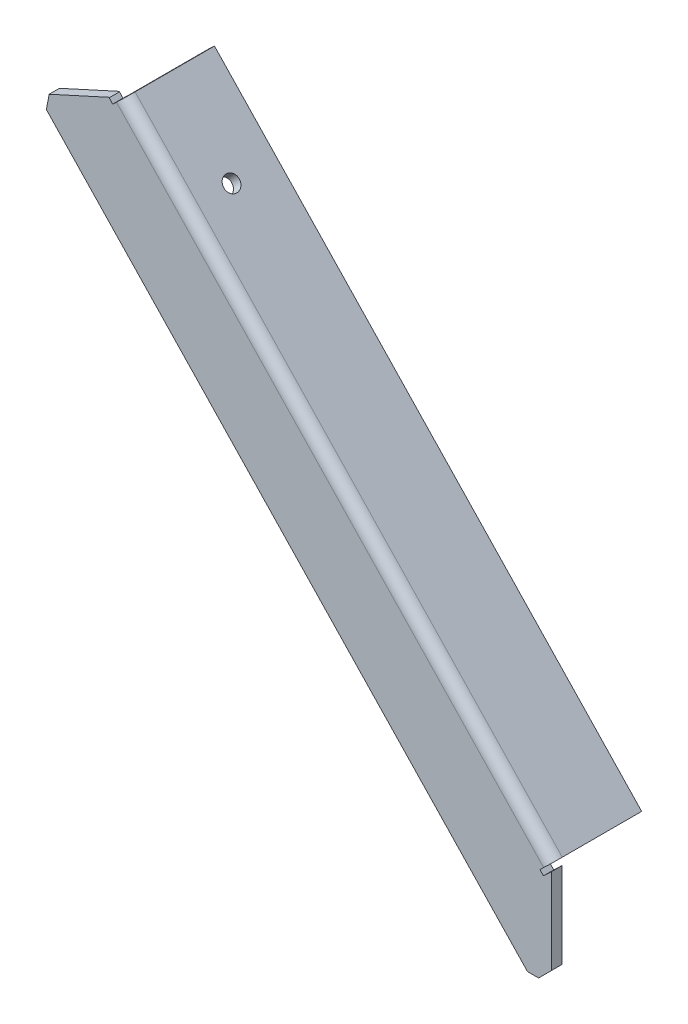
ISO-10303-21;
HEADER;
FILE_DESCRIPTION(('STEP AP214'),'2;1');
FILE_NAME('part.step','',(''),(''),'','','');
FILE_SCHEMA(('AUTOMOTIVE_DESIGN { 1 0 10303 214 1 1 1 1 }'));
ENDSEC;
DATA;
#1=APPLICATION_CONTEXT('core data for automotive mechanical design processes');
#2=APPLICATION_PROTOCOL_DEFINITION('international standard','automotive_design',2000,#1);
#3=PRODUCT_CONTEXT('',#1,'mechanical');
#4=PRODUCT('Part','Part','',(#3));
#5=PRODUCT_RELATED_PRODUCT_CATEGORY('part','',(#4));
#6=PRODUCT_DEFINITION_FORMATION('','',#4);
#7=PRODUCT_DEFINITION_CONTEXT('part definition',#1,'design');
#8=PRODUCT_DEFINITION('design','',#6,#7);
#9=PRODUCT_DEFINITION_SHAPE('','',#8);
#10=(LENGTH_UNIT() NAMED_UNIT(*) SI_UNIT(.MILLI.,.METRE.));
#11=(NAMED_UNIT(*) PLANE_ANGLE_UNIT() SI_UNIT($,.RADIAN.));
#12=(NAMED_UNIT(*) SI_UNIT($,.STERADIAN.) SOLID_ANGLE_UNIT());
#13=UNCERTAINTY_MEASURE_WITH_UNIT(LENGTH_MEASURE(1.E-05),#10,'distance_accuracy_value','');
#14=(GEOMETRIC_REPRESENTATION_CONTEXT(3) GLOBAL_UNCERTAINTY_ASSIGNED_CONTEXT((#13)) GLOBAL_UNIT_ASSIGNED_CONTEXT((#10,
#11,#12)) REPRESENTATION_CONTEXT('',''));
#15=CARTESIAN_POINT('',(0.,0.,0.));
#16=DIRECTION('',(0.,0.,1.));
#17=DIRECTION('',(1.,0.,0.));
#18=AXIS2_PLACEMENT_3D('',#15,#16,#17);
#19=CARTESIAN_POINT('',(-68.257223266206,120.395137547564,-4.));
#20=DIRECTION('',(-0.414693242656259,0.909961270876534,0.));
#21=DIRECTION('',(-0.909961270876534,-0.414693242656259,0.));
#22=AXIS2_PLACEMENT_3D('',#19,#20,#21);
#23=PLANE('',#22);
#24=DIRECTION('',(-0.909961270876534,-0.414693242656259,0.));
#25=VECTOR('',#24,1.);
#26=CARTESIAN_POINT('',(-68.257223266206,120.395137547564,0.));
#27=LINE('',#26,#25);
#28=CARTESIAN_POINT('',(-73.8308182261847,117.855103986597,0.));
#29=VERTEX_POINT('',#28);
#30=CARTESIAN_POINT('',(-97.4029724139567,107.112654423767,0.));
#31=VERTEX_POINT('',#30);
#32=EDGE_CURVE('E248',#29,#31,#27,.T.);
#33=ORIENTED_EDGE('',*,*,#32,.F.);
#34=DIRECTION('',(0.,0.,1.));
#35=VECTOR('',#34,1.);
#36=CARTESIAN_POINT('',(-73.8308182261848,117.855103986597,-3.99999999999999));
#37=LINE('',#36,#35);
#38=CARTESIAN_POINT('',(-73.8308182261847,117.855103986597,-4.));
#39=VERTEX_POINT('',#38);
#40=EDGE_CURVE('E264',#39,#29,#37,.T.);
#41=ORIENTED_EDGE('',*,*,#40,.F.);
#42=DIRECTION('',(-0.909961270876534,-0.414693242656259,0.));
#43=VECTOR('',#42,1.);
#44=CARTESIAN_POINT('',(-68.257223266206,120.395137547564,-4.));
#45=LINE('',#44,#43);
#46=CARTESIAN_POINT('',(-97.4029724139567,107.112654423767,-4.));
#47=VERTEX_POINT('',#46);
#48=EDGE_CURVE('E276',#39,#47,#45,.T.);
#49=ORIENTED_EDGE('',*,*,#48,.T.);
#50=DIRECTION('',(0.,0.,1.));
#51=VECTOR('',#50,1.);
#52=CARTESIAN_POINT('',(-97.4029724139567,107.112654423767,-4.));
#53=LINE('',#52,#51);
#54=EDGE_CURVE('E294',#47,#31,#53,.T.);
#55=ORIENTED_EDGE('',*,*,#54,.T.);
#56=EDGE_LOOP('',(#33,#41,#49,#55));
#57=FACE_BOUND('',#56,.T.);
#58=ADVANCED_FACE('F57',(#57),#23,.T.);
#59=CARTESIAN_POINT('',(97.5287824201261,-89.9528059930263,-4.));
#60=DIRECTION('',(1.,0.,0.));
#61=DIRECTION('',(0.,0.,-1.));
#62=AXIS2_PLACEMENT_3D('',#59,#60,#61);
#63=PLANE('',#62);
#64=DIRECTION('',(0.,1.,0.));
#65=VECTOR('',#64,1.);
#66=CARTESIAN_POINT('',(97.5287824201261,-89.9528059930263,-4.));
#67=LINE('',#66,#65);
#68=CARTESIAN_POINT('',(97.5287824201261,-89.9528059930263,-4.));
#69=VERTEX_POINT('',#68);
#70=CARTESIAN_POINT('',(97.5287824201261,-56.712657403248,-4.));
#71=VERTEX_POINT('',#70);
#72=EDGE_CURVE('E291',#69,#71,#67,.T.);
#73=ORIENTED_EDGE('',*,*,#72,.T.);
#74=DIRECTION('',(0.,0.,1.));
#75=VECTOR('',#74,1.);
#76=CARTESIAN_POINT('',(97.5287824201261,-56.712657403248,-3.99999999999999));
#77=LINE('',#76,#75);
#78=CARTESIAN_POINT('',(97.5287824201261,-56.712657403248,0.));
#79=VERTEX_POINT('',#78);
#80=EDGE_CURVE('E249',#71,#79,#77,.T.);
#81=ORIENTED_EDGE('',*,*,#80,.T.);
#82=DIRECTION('',(0.,1.,0.));
#83=VECTOR('',#82,1.);
#84=CARTESIAN_POINT('',(97.5287824201261,-89.9528059930263,0.));
#85=LINE('',#84,#83);
#86=CARTESIAN_POINT('',(97.5287824201261,-89.9528059930263,0.));
#87=VERTEX_POINT('',#86);
#88=EDGE_CURVE('E279',#87,#79,#85,.T.);
#89=ORIENTED_EDGE('',*,*,#88,.F.);
#90=DIRECTION('',(0.,0.,1.));
#91=VECTOR('',#90,1.);
#92=CARTESIAN_POINT('',(97.5287824201261,-89.9528059930263,-4.));
#93=LINE('',#92,#91);
#94=EDGE_CURVE('E310',#69,#87,#93,.T.);
#95=ORIENTED_EDGE('',*,*,#94,.F.);
#96=EDGE_LOOP('',(#73,#81,#89,#95));
#97=FACE_BOUND('',#96,.T.);
#98=ADVANCED_FACE('F344',(#97),#63,.T.);
#99=CARTESIAN_POINT('',(0.,0.,-4.));
#100=DIRECTION('',(0.,0.,-1.));
#101=DIRECTION('',(-1.,0.,0.));
#102=AXIS2_PLACEMENT_3D('',#99,#100,#101);
#103=PLANE('',#102);
#104=DIRECTION('',(-0.689089026915392,0.72467669548896,0.));
#105=VECTOR('',#104,1.);
#106=CARTESIAN_POINT('',(94.4139649619253,-59.6745113508797,-3.99999999999998));
#107=LINE('',#106,#105);
#108=CARTESIAN_POINT('',(94.4139649619253,-59.6745113508797,-4.));
#109=VERTEX_POINT('',#108);
#110=CARTESIAN_POINT('',(93.0357869080945,-58.2251579599017,-4.));
#111=VERTEX_POINT('',#110);
#112=EDGE_CURVE('E72',#109,#111,#107,.T.);
#113=ORIENTED_EDGE('',*,*,#112,.F.);
#114=DIRECTION('',(-0.72467669548896,-0.689089026915392,0.));
#115=VECTOR('',#114,1.);
#116=CARTESIAN_POINT('',(97.5287824201261,-56.712657403248,-3.99999999999999));
#117=LINE('',#116,#115);
#118=EDGE_CURVE('E245',#71,#109,#117,.T.);
#119=ORIENTED_EDGE('',*,*,#118,.F.);
#120=ORIENTED_EDGE('',*,*,#72,.F.);
#121=DIRECTION('',(0.707106781186548,0.707106781186548,0.));
#122=VECTOR('',#121,1.);
#123=CARTESIAN_POINT('',(92.5287824201262,-94.9528059930262,-4.));
#124=LINE('',#123,#122);
#125=CARTESIAN_POINT('',(92.5287824201262,-94.9528059930262,-4.));
#126=VERTEX_POINT('',#125);
#127=EDGE_CURVE('E288',#126,#69,#124,.T.);
#128=ORIENTED_EDGE('',*,*,#127,.F.);
#129=DIRECTION('',(1.,0.,0.));
#130=VECTOR('',#129,1.);
#131=CARTESIAN_POINT('',(88.2179408566115,-94.9528059930262,-4.));
#132=LINE('',#131,#130);
#133=CARTESIAN_POINT('',(88.2179408566115,-94.9528059930262,-4.));
#134=VERTEX_POINT('',#133);
#135=EDGE_CURVE('E285',#134,#126,#132,.T.);
#136=ORIENTED_EDGE('',*,*,#135,.F.);
#137=DIRECTION('',(0.689089026915392,-0.724676695488959,0.));
#138=VECTOR('',#137,1.);
#139=CARTESIAN_POINT('',(88.2179408566115,-94.9528059930262,-4.));
#140=LINE('',#139,#138);
#141=CARTESIAN_POINT('',(-98.5073336337625,101.415804733041,-4.));
#142=VERTEX_POINT('',#141);
#143=EDGE_CURVE('E282',#142,#134,#140,.T.);
#144=ORIENTED_EDGE('',*,*,#143,.F.);
#145=DIRECTION('',(-0.190311776555318,-0.981723702323805,0.));
#146=VECTOR('',#145,1.);
#147=CARTESIAN_POINT('',(-98.5073336337625,101.415804733041,-4.));
#148=LINE('',#147,#146);
#149=EDGE_CURVE('E278',#47,#142,#148,.T.);
#150=ORIENTED_EDGE('',*,*,#149,.F.);
#151=ORIENTED_EDGE('',*,*,#48,.F.);
#152=DIRECTION('',(0.724676695488965,0.689089026915386,0.));
#153=VECTOR('',#152,1.);
#154=CARTESIAN_POINT('',(-74.1283968320683,117.572138971666,-3.99999999999998));
#155=LINE('',#154,#153);
#156=CARTESIAN_POINT('',(-74.1283968320683,117.572138971666,-4.));
#157=VERTEX_POINT('',#156);
#158=EDGE_CURVE('E261',#157,#39,#155,.T.);
#159=ORIENTED_EDGE('',*,*,#158,.F.);
#160=DIRECTION('',(-0.689089026915392,0.72467669548896,0.));
#161=VECTOR('',#160,1.);
#162=CARTESIAN_POINT('',(-72.7502187782376,116.122785580688,-3.99999999999998));
#163=LINE('',#162,#161);
#164=CARTESIAN_POINT('',(-72.7502187782376,116.122785580688,-4.));
#165=VERTEX_POINT('',#164);
#166=EDGE_CURVE('E257',#165,#157,#163,.T.);
#167=ORIENTED_EDGE('',*,*,#166,.F.);
#168=DIRECTION('',(-0.72467669548896,-0.689089026915392,0.));
#169=VECTOR('',#168,1.);
#170=CARTESIAN_POINT('',(-71.3008653872596,117.500963634519,-3.99999999999998));
#171=LINE('',#170,#169);
#172=CARTESIAN_POINT('',(-71.3008653872596,117.500963634519,-4.));
#173=VERTEX_POINT('',#172);
#174=EDGE_CURVE('E254',#173,#165,#171,.T.);
#175=ORIENTED_EDGE('',*,*,#174,.F.);
#176=DIRECTION('',(0.689089026915392,-0.72467669548896,0.));
#177=VECTOR('',#176,1.);
#178=CARTESIAN_POINT('',(94.4851402990725,-56.846979906071,-3.99999999999998));
#179=LINE('',#178,#177);
#180=CARTESIAN_POINT('',(94.4851402990724,-56.846979906071,-4.));
#181=VERTEX_POINT('',#180);
#182=EDGE_CURVE('E236',#181,#173,#179,.F.);
#183=ORIENTED_EDGE('',*,*,#182,.F.);
#184=DIRECTION('',(0.72467669548896,0.689089026915392,0.));
#185=VECTOR('',#184,1.);
#186=CARTESIAN_POINT('',(93.0357869080945,-58.2251579599018,-3.99999999999998));
#187=LINE('',#186,#185);
#188=EDGE_CURVE('E77',#111,#181,#187,.T.);
#189=ORIENTED_EDGE('',*,*,#188,.F.);
#190=EDGE_LOOP('',(#113,#119,#120,#128,#136,#144,#150,#151,#159,#167,#175,#183,#189));
#191=FACE_BOUND('',#190,.T.);
#192=ADVANCED_FACE('F341',(#191),#103,.T.);
#193=CARTESIAN_POINT('',(0.,0.,0.));
#194=DIRECTION('',(0.,0.,-1.));
#195=DIRECTION('',(-1.,0.,0.));
#196=AXIS2_PLACEMENT_3D('',#193,#194,#195);
#197=PLANE('',#196);
#198=DIRECTION('',(0.72467669548896,0.689089026915392,0.));
#199=VECTOR('',#198,1.);
#200=CARTESIAN_POINT('',(74.6313425518323,-78.4856420402801,0.));
#201=LINE('',#200,#199);
#202=CARTESIAN_POINT('',(94.4139649619253,-59.6745113508797,0.));
#203=VERTEX_POINT('',#202);
#204=EDGE_CURVE('E13',#203,#79,#201,.T.);
#205=ORIENTED_EDGE('',*,*,#204,.F.);
#206=DIRECTION('',(0.689089026915392,-0.72467669548896,0.));
#207=VECTOR('',#206,1.);
#208=CARTESIAN_POINT('',(19.7826224100931,18.8111306894004,0.));
#209=LINE('',#208,#207);
#210=CARTESIAN_POINT('',(93.0357869080945,-58.2251579599017,0.));
#211=VERTEX_POINT('',#210);
#212=EDGE_CURVE('E65',#211,#203,#209,.T.);
#213=ORIENTED_EDGE('',*,*,#212,.F.);
#214=DIRECTION('',(-0.72467669548896,-0.689089026915392,0.));
#215=VECTOR('',#214,1.);
#216=CARTESIAN_POINT('',(73.2531644980014,-77.0362886493022,0.));
#217=LINE('',#216,#215);
#218=CARTESIAN_POINT('',(94.4851402990722,-56.8469799060712,0.));
#219=VERTEX_POINT('',#218);
#220=EDGE_CURVE('E329',#219,#211,#217,.T.);
#221=ORIENTED_EDGE('',*,*,#220,.F.);
#222=DIRECTION('',(0.689089026915392,-0.72467669548896,0.));
#223=VECTOR('',#222,1.);
#224=CARTESIAN_POINT('',(94.4851402990722,-56.8469799060713,0.));
#225=LINE('',#224,#223);
#226=CARTESIAN_POINT('',(-71.3008653872596,117.500963634519,0.));
#227=VERTEX_POINT('',#226);
#228=EDGE_CURVE('E182',#219,#227,#225,.F.);
#229=ORIENTED_EDGE('',*,*,#228,.T.);
#230=DIRECTION('',(0.72467669548896,0.689089026915392,0.));
#231=VECTOR('',#230,1.);
#232=CARTESIAN_POINT('',(-92.5328411883306,97.3116548912881,0.));
#233=LINE('',#232,#231);
#234=CARTESIAN_POINT('',(-72.7502187782376,116.122785580688,0.));
#235=VERTEX_POINT('',#234);
#236=EDGE_CURVE('E326',#235,#227,#233,.T.);
#237=ORIENTED_EDGE('',*,*,#236,.F.);
#238=DIRECTION('',(0.689089026915392,-0.72467669548896,0.));
#239=VECTOR('',#238,1.);
#240=CARTESIAN_POINT('',(19.782622410093,18.8111306894003,0.));
#241=LINE('',#240,#239);
#242=CARTESIAN_POINT('',(-74.1283968320683,117.572138971666,0.));
#243=VERTEX_POINT('',#242);
#244=EDGE_CURVE('E323',#243,#235,#241,.T.);
#245=ORIENTED_EDGE('',*,*,#244,.F.);
#246=DIRECTION('',(-0.724676695488965,-0.689089026915386,0.));
#247=VECTOR('',#246,1.);
#248=CARTESIAN_POINT('',(-93.9110192421607,98.7610082822669,0.));
#249=LINE('',#248,#247);
#250=EDGE_CURVE('E312',#29,#243,#249,.T.);
#251=ORIENTED_EDGE('',*,*,#250,.F.);
#252=ORIENTED_EDGE('',*,*,#32,.T.);
#253=DIRECTION('',(-0.190311776555318,-0.981723702323805,0.));
#254=VECTOR('',#253,1.);
#255=CARTESIAN_POINT('',(-98.5073336337625,101.415804733041,0.));
#256=LINE('',#255,#254);
#257=CARTESIAN_POINT('',(-98.5073336337625,101.415804733041,0.));
#258=VERTEX_POINT('',#257);
#259=EDGE_CURVE('E296',#31,#258,#256,.T.);
#260=ORIENTED_EDGE('',*,*,#259,.T.);
#261=DIRECTION('',(0.689089026915392,-0.724676695488959,0.));
#262=VECTOR('',#261,1.);
#263=CARTESIAN_POINT('',(88.2179408566115,-94.9528059930262,0.));
#264=LINE('',#263,#262);
#265=CARTESIAN_POINT('',(88.2179408566115,-94.9528059930262,0.));
#266=VERTEX_POINT('',#265);
#267=EDGE_CURVE('E299',#258,#266,#264,.T.);
#268=ORIENTED_EDGE('',*,*,#267,.T.);
#269=DIRECTION('',(1.,0.,0.));
#270=VECTOR('',#269,1.);
#271=CARTESIAN_POINT('',(88.2179408566115,-94.9528059930262,0.));
#272=LINE('',#271,#270);
#273=CARTESIAN_POINT('',(92.5287824201262,-94.9528059930262,0.));
#274=VERTEX_POINT('',#273);
#275=EDGE_CURVE('E302',#266,#274,#272,.T.);
#276=ORIENTED_EDGE('',*,*,#275,.T.);
#277=DIRECTION('',(0.707106781186548,0.707106781186548,0.));
#278=VECTOR('',#277,1.);
#279=CARTESIAN_POINT('',(92.5287824201262,-94.9528059930262,0.));
#280=LINE('',#279,#278);
#281=EDGE_CURVE('E305',#274,#87,#280,.T.);
#282=ORIENTED_EDGE('',*,*,#281,.T.);
#283=ORIENTED_EDGE('',*,*,#88,.T.);
#284=EDGE_LOOP('',(#205,#213,#221,#229,#237,#245,#251,#252,#260,#268,#276,#282,#283));
#285=FACE_BOUND('',#284,.T.);
#286=ADVANCED_FACE('F414',(#285),#197,.F.);
#287=CARTESIAN_POINT('',(92.5287824201262,-94.9528059930262,-4.));
#288=DIRECTION('',(0.707106781186547,-0.707106781186547,0.));
#289=DIRECTION('',(0.707106781186548,0.707106781186548,0.));
#290=AXIS2_PLACEMENT_3D('',#287,#288,#289);
#291=PLANE('',#290);
#292=ORIENTED_EDGE('',*,*,#281,.F.);
#293=DIRECTION('',(0.,0.,1.));
#294=VECTOR('',#293,1.);
#295=CARTESIAN_POINT('',(92.5287824201262,-94.9528059930262,-4.));
#296=LINE('',#295,#294);
#297=EDGE_CURVE('E313',#126,#274,#296,.T.);
#298=ORIENTED_EDGE('',*,*,#297,.F.);
#299=ORIENTED_EDGE('',*,*,#127,.T.);
#300=ORIENTED_EDGE('',*,*,#94,.T.);
#301=EDGE_LOOP('',(#292,#298,#299,#300));
#302=FACE_BOUND('',#301,.T.);
#303=ADVANCED_FACE('F348',(#302),#291,.T.);
#304=CARTESIAN_POINT('',(88.2179408566115,-94.9528059930262,-4.));
#305=DIRECTION('',(0.,-1.,0.));
#306=DIRECTION('',(0.,0.,-1.));
#307=AXIS2_PLACEMENT_3D('',#304,#305,#306);
#308=PLANE('',#307);
#309=ORIENTED_EDGE('',*,*,#275,.F.);
#310=DIRECTION('',(0.,0.,1.));
#311=VECTOR('',#310,1.);
#312=CARTESIAN_POINT('',(88.2179408566115,-94.9528059930262,-4.));
#313=LINE('',#312,#311);
#314=EDGE_CURVE('E315',#134,#266,#313,.T.);
#315=ORIENTED_EDGE('',*,*,#314,.F.);
#316=ORIENTED_EDGE('',*,*,#135,.T.);
#317=ORIENTED_EDGE('',*,*,#297,.T.);
#318=EDGE_LOOP('',(#309,#315,#316,#317));
#319=FACE_BOUND('',#318,.T.);
#320=ADVANCED_FACE('F353',(#319),#308,.T.);
#321=CARTESIAN_POINT('',(88.2179408566115,-94.9528059930262,-4.));
#322=DIRECTION('',(-0.724676695488959,-0.689089026915392,0.));
#323=DIRECTION('',(0.689089026915393,-0.724676695488959,0.));
#324=AXIS2_PLACEMENT_3D('',#321,#322,#323);
#325=PLANE('',#324);
#326=ORIENTED_EDGE('',*,*,#267,.F.);
#327=DIRECTION('',(0.,0.,1.));
#328=VECTOR('',#327,1.);
#329=CARTESIAN_POINT('',(-98.5073336337625,101.415804733041,-4.));
#330=LINE('',#329,#328);
#331=EDGE_CURVE('E317',#142,#258,#330,.T.);
#332=ORIENTED_EDGE('',*,*,#331,.F.);
#333=ORIENTED_EDGE('',*,*,#143,.T.);
#334=ORIENTED_EDGE('',*,*,#314,.T.);
#335=EDGE_LOOP('',(#326,#332,#333,#334));
#336=FACE_BOUND('',#335,.T.);
#337=ADVANCED_FACE('F356',(#336),#325,.T.);
#338=CARTESIAN_POINT('',(-98.5073336337625,101.415804733041,-4.));
#339=DIRECTION('',(-0.981723702323805,0.190311776555318,0.));
#340=DIRECTION('',(-0.190311776555318,-0.981723702323805,0.));
#341=AXIS2_PLACEMENT_3D('',#338,#339,#340);
#342=PLANE('',#341);
#343=ORIENTED_EDGE('',*,*,#259,.F.);
#344=ORIENTED_EDGE('',*,*,#54,.F.);
#345=ORIENTED_EDGE('',*,*,#149,.T.);
#346=ORIENTED_EDGE('',*,*,#331,.T.);
#347=EDGE_LOOP('',(#343,#344,#345,#346));
#348=FACE_BOUND('',#347,.T.);
#349=ADVANCED_FACE('F362',(#348),#342,.T.);
#350=CARTESIAN_POINT('',(97.5287824201261,-56.712657403248,-3.99999999999999));
#351=DIRECTION('',(-0.689089026915392,0.72467669548896,0.));
#352=DIRECTION('',(-0.72467669548896,-0.689089026915392,0.));
#353=AXIS2_PLACEMENT_3D('',#350,#351,#352);
#354=PLANE('',#353);
#355=DIRECTION('',(0.,0.,1.));
#356=VECTOR('',#355,1.);
#357=CARTESIAN_POINT('',(94.4139649619253,-59.6745113508797,-3.99999999999998));
#358=LINE('',#357,#356);
#359=EDGE_CURVE('E251',#109,#203,#358,.T.);
#360=ORIENTED_EDGE('',*,*,#359,.T.);
#361=ORIENTED_EDGE('',*,*,#204,.T.);
#362=ORIENTED_EDGE('',*,*,#80,.F.);
#363=ORIENTED_EDGE('',*,*,#118,.T.);
#364=EDGE_LOOP('',(#360,#361,#362,#363));
#365=FACE_BOUND('',#364,.T.);
#366=ADVANCED_FACE('F338',(#365),#354,.T.);
#367=CARTESIAN_POINT('',(94.4139649619253,-59.6745113508797,-3.99999999999998));
#368=DIRECTION('',(0.72467669548896,0.689089026915392,0.));
#369=DIRECTION('',(-0.689089026915392,0.72467669548896,0.));
#370=AXIS2_PLACEMENT_3D('',#367,#368,#369);
#371=PLANE('',#370);
#372=DIRECTION('',(0.,0.,1.));
#373=VECTOR('',#372,1.);
#374=CARTESIAN_POINT('',(93.0357869080945,-58.2251579599018,-3.99999999999998));
#375=LINE('',#374,#373);
#376=EDGE_CURVE('E253',#111,#211,#375,.T.);
#377=ORIENTED_EDGE('',*,*,#376,.T.);
#378=ORIENTED_EDGE('',*,*,#212,.T.);
#379=ORIENTED_EDGE('',*,*,#359,.F.);
#380=ORIENTED_EDGE('',*,*,#112,.T.);
#381=EDGE_LOOP('',(#377,#378,#379,#380));
#382=FACE_BOUND('',#381,.T.);
#383=ADVANCED_FACE('F334',(#382),#371,.T.);
#384=CARTESIAN_POINT('',(93.0357869080945,-58.2251579599018,-3.99999999999998));
#385=DIRECTION('',(0.689089026915392,-0.72467669548896,0.));
#386=DIRECTION('',(0.72467669548896,0.689089026915392,0.));
#387=AXIS2_PLACEMENT_3D('',#384,#385,#386);
#388=PLANE('',#387);
#389=DIRECTION('',(0.,0.,1.));
#390=VECTOR('',#389,1.);
#391=CARTESIAN_POINT('',(94.4851402990724,-56.846979906071,-3.99999999999998));
#392=LINE('',#391,#390);
#393=EDGE_CURVE('E232',#181,#219,#392,.T.);
#394=ORIENTED_EDGE('',*,*,#393,.T.);
#395=ORIENTED_EDGE('',*,*,#220,.T.);
#396=ORIENTED_EDGE('',*,*,#376,.F.);
#397=ORIENTED_EDGE('',*,*,#188,.T.);
#398=EDGE_LOOP('',(#394,#395,#396,#397));
#399=FACE_BOUND('',#398,.T.);
#400=ADVANCED_FACE('F431',(#399),#388,.T.);
#401=CARTESIAN_POINT('',(-71.3008653872596,117.500963634519,-3.99999999999998));
#402=DIRECTION('',(-0.689089026915392,0.72467669548896,0.));
#403=DIRECTION('',(-0.72467669548896,-0.689089026915392,0.));
#404=AXIS2_PLACEMENT_3D('',#401,#402,#403);
#405=PLANE('',#404);
#406=DIRECTION('',(0.,0.,1.));
#407=VECTOR('',#406,1.);
#408=CARTESIAN_POINT('',(-72.7502187782376,116.122785580688,-3.99999999999998));
#409=LINE('',#408,#407);
#410=EDGE_CURVE('E260',#165,#235,#409,.T.);
#411=ORIENTED_EDGE('',*,*,#410,.T.);
#412=ORIENTED_EDGE('',*,*,#236,.T.);
#413=DIRECTION('',(0.,-1.38777878078132E-13,1.));
#414=VECTOR('',#413,1.);
#415=CARTESIAN_POINT('',(-71.3008653872596,117.500963634519,-3.99999999999998));
#416=LINE('',#415,#414);
#417=EDGE_CURVE('E240',#173,#227,#416,.T.);
#418=ORIENTED_EDGE('',*,*,#417,.F.);
#419=ORIENTED_EDGE('',*,*,#174,.T.);
#420=EDGE_LOOP('',(#411,#412,#418,#419));
#421=FACE_BOUND('',#420,.T.);
#422=ADVANCED_FACE('F373',(#421),#405,.T.);
#423=CARTESIAN_POINT('',(-72.7502187782376,116.122785580688,-3.99999999999998));
#424=DIRECTION('',(0.72467669548896,0.689089026915392,0.));
#425=DIRECTION('',(-0.689089026915392,0.72467669548896,0.));
#426=AXIS2_PLACEMENT_3D('',#423,#424,#425);
#427=PLANE('',#426);
#428=DIRECTION('',(0.,0.,1.));
#429=VECTOR('',#428,1.);
#430=CARTESIAN_POINT('',(-74.1283968320683,117.572138971666,-3.99999999999998));
#431=LINE('',#430,#429);
#432=EDGE_CURVE('E243',#157,#243,#431,.T.);
#433=ORIENTED_EDGE('',*,*,#432,.T.);
#434=ORIENTED_EDGE('',*,*,#244,.T.);
#435=ORIENTED_EDGE('',*,*,#410,.F.);
#436=ORIENTED_EDGE('',*,*,#166,.T.);
#437=EDGE_LOOP('',(#433,#434,#435,#436));
#438=FACE_BOUND('',#437,.T.);
#439=ADVANCED_FACE('F370',(#438),#427,.T.);
#440=CARTESIAN_POINT('',(-74.1283968320683,117.572138971666,-3.99999999999998));
#441=DIRECTION('',(0.689089026915386,-0.724676695488965,0.));
#442=DIRECTION('',(0.724676695488965,0.689089026915386,0.));
#443=AXIS2_PLACEMENT_3D('',#440,#441,#442);
#444=PLANE('',#443);
#445=ORIENTED_EDGE('',*,*,#40,.T.);
#446=ORIENTED_EDGE('',*,*,#250,.T.);
#447=ORIENTED_EDGE('',*,*,#432,.F.);
#448=ORIENTED_EDGE('',*,*,#158,.T.);
#449=EDGE_LOOP('',(#445,#446,#447,#448));
#450=FACE_BOUND('',#449,.T.);
#451=ADVANCED_FACE('F367',(#450),#444,.T.);
#452=CARTESIAN_POINT('',(-71.3008653872596,117.500963634519,-4.2));
#453=DIRECTION('',(-0.689089026915392,0.72467669548896,0.));
#454=DIRECTION('',(-0.72467669548896,-0.689089026915392,0.));
#455=AXIS2_PLACEMENT_3D('',#452,#453,#454);
#456=PLANE('',#455);
#457=DIRECTION('',(0.72467669548896,0.689089026915392,0.));
#458=VECTOR('',#457,1.);
#459=CARTESIAN_POINT('',(-68.257223266206,120.395137547564,-4.19999999999999));
#460=LINE('',#459,#458);
#461=CARTESIAN_POINT('',(-71.1559300481618,117.638781439902,-4.2));
#462=VERTEX_POINT('',#461);
#463=CARTESIAN_POINT('',(-68.257223266206,120.395137547564,-4.19999999999999));
#464=VERTEX_POINT('',#463);
#465=EDGE_CURVE('E227',#462,#464,#460,.T.);
#466=ORIENTED_EDGE('',*,*,#465,.F.);
#467=CARTESIAN_POINT('',(-71.3008653872596,117.500963634519,-4.2));
#468=DIRECTION('',(0.689089026915392,-0.72467669548896,0.));
#469=DIRECTION('',(0.72467669548896,0.689089026915392,0.));
#470=AXIS2_PLACEMENT_3D('',#467,#468,#469);
#471=CIRCLE('',#470,0.200000000000019);
#472=EDGE_CURVE('E185',#173,#462,#471,.F.);
#473=ORIENTED_EDGE('',*,*,#472,.F.);
#474=ORIENTED_EDGE('',*,*,#417,.T.);
#475=CARTESIAN_POINT('',(-71.3008653872596,117.500963634519,-4.2));
#476=DIRECTION('',(0.689089026915392,-0.72467669548896,0.));
#477=DIRECTION('',(0.72467669548896,0.689089026915392,0.));
#478=AXIS2_PLACEMENT_3D('',#475,#476,#477);
#479=CIRCLE('',#478,4.20000000000002);
#480=EDGE_CURVE('E231',#227,#464,#479,.F.);
#481=ORIENTED_EDGE('',*,*,#480,.T.);
#482=EDGE_LOOP('',(#466,#473,#474,#481));
#483=FACE_BOUND('',#482,.T.);
#484=ADVANCED_FACE('F379',(#483),#456,.T.);
#485=CARTESIAN_POINT('',(94.4851402990725,-56.846979906071,-4.2));
#486=DIRECTION('',(-0.689089026915392,0.72467669548896,0.));
#487=DIRECTION('',(-0.72467669548896,-0.689089026915392,0.));
#488=AXIS2_PLACEMENT_3D('',#485,#486,#487);
#489=PLANE('',#488);
#490=CARTESIAN_POINT('',(94.4851402990725,-56.846979906071,-4.2));
#491=DIRECTION('',(0.689089026915392,-0.72467669548896,0.));
#492=DIRECTION('',(0.72467669548896,0.689089026915392,0.));
#493=AXIS2_PLACEMENT_3D('',#490,#491,#492);
#494=CIRCLE('',#493,0.200000000000019);
#495=CARTESIAN_POINT('',(94.6300756381703,-56.7091621006879,-4.2));
#496=VERTEX_POINT('',#495);
#497=EDGE_CURVE('E192',#496,#181,#494,.T.);
#498=ORIENTED_EDGE('',*,*,#497,.F.);
#499=DIRECTION('',(0.72467669548896,0.689089026915392,0.));
#500=VECTOR('',#499,1.);
#501=CARTESIAN_POINT('',(94.6300756381702,-56.7091621006879,-4.2));
#502=LINE('',#501,#500);
#503=CARTESIAN_POINT('',(97.5287824201261,-53.9528059930263,-4.19999999999999));
#504=VERTEX_POINT('',#503);
#505=EDGE_CURVE('E189',#496,#504,#502,.T.);
#506=ORIENTED_EDGE('',*,*,#505,.T.);
#507=CARTESIAN_POINT('',(94.4851402990725,-56.846979906071,-4.2));
#508=DIRECTION('',(0.689089026915392,-0.72467669548896,0.));
#509=DIRECTION('',(0.72467669548896,0.689089026915392,0.));
#510=AXIS2_PLACEMENT_3D('',#507,#508,#509);
#511=CIRCLE('',#510,4.20000000000002);
#512=EDGE_CURVE('E175',#504,#219,#511,.T.);
#513=ORIENTED_EDGE('',*,*,#512,.T.);
#514=ORIENTED_EDGE('',*,*,#393,.F.);
#515=EDGE_LOOP('',(#498,#506,#513,#514));
#516=FACE_BOUND('',#515,.T.);
#517=ADVANCED_FACE('F190',(#516),#489,.F.);
#518=CARTESIAN_POINT('',(94.4851402990725,-56.846979906071,-4.2));
#519=DIRECTION('',(0.689089026915392,-0.72467669548896,0.));
#520=DIRECTION('',(0.72467669548896,0.689089026915392,0.));
#521=AXIS2_PLACEMENT_3D('',#518,#519,#520);
#522=CYLINDRICAL_SURFACE('',#521,4.20000000000002);
#523=ORIENTED_EDGE('',*,*,#228,.F.);
#524=ORIENTED_EDGE('',*,*,#512,.F.);
#525=DIRECTION('',(0.689089026915392,-0.72467669548896,0.));
#526=VECTOR('',#525,1.);
#527=CARTESIAN_POINT('',(24.2756179221246,23.0834826562758,-4.19999999999999));
#528=LINE('',#527,#526);
#529=EDGE_CURVE('E180',#464,#504,#528,.T.);
#530=ORIENTED_EDGE('',*,*,#529,.F.);
#531=ORIENTED_EDGE('',*,*,#480,.F.);
#532=EDGE_LOOP('',(#523,#524,#530,#531));
#533=FACE_BOUND('',#532,.T.);
#534=ADVANCED_FACE('F177',(#533),#522,.T.);
#535=CARTESIAN_POINT('',(94.4851402990725,-56.846979906071,-4.2));
#536=DIRECTION('',(0.689089026915392,-0.72467669548896,0.));
#537=DIRECTION('',(0.72467669548896,0.689089026915392,0.));
#538=AXIS2_PLACEMENT_3D('',#535,#536,#537);
#539=CYLINDRICAL_SURFACE('',#538,0.200000000000019);
#540=ORIENTED_EDGE('',*,*,#182,.T.);
#541=ORIENTED_EDGE('',*,*,#472,.T.);
#542=DIRECTION('',(-0.689089026915392,0.72467669548896,0.));
#543=VECTOR('',#542,1.);
#544=CARTESIAN_POINT('',(-71.1559300481618,117.638781439902,-4.2));
#545=LINE('',#544,#543);
#546=EDGE_CURVE('E197',#462,#496,#545,.F.);
#547=ORIENTED_EDGE('',*,*,#546,.T.);
#548=ORIENTED_EDGE('',*,*,#497,.T.);
#549=EDGE_LOOP('',(#540,#541,#547,#548));
#550=FACE_BOUND('',#549,.T.);
#551=ADVANCED_FACE('F377',(#550),#539,.F.);
#552=CARTESIAN_POINT('',(97.5287824201261,-53.9528059930263,-3.99999999999999));
#553=DIRECTION('',(0.689089026915392,-0.72467669548896,0.));
#554=DIRECTION('',(0.72467669548896,0.689089026915392,0.));
#555=AXIS2_PLACEMENT_3D('',#552,#553,#554);
#556=PLANE('',#555);
#557=DIRECTION('',(0.,0.,1.));
#558=VECTOR('',#557,1.);
#559=CARTESIAN_POINT('',(97.5287824201261,-53.9528059930263,-3.99999999999999));
#560=LINE('',#559,#558);
#561=CARTESIAN_POINT('',(97.5287824201262,-53.9528059930263,-35.));
#562=VERTEX_POINT('',#561);
#563=EDGE_CURVE('E204',#562,#504,#560,.T.);
#564=ORIENTED_EDGE('',*,*,#563,.T.);
#565=ORIENTED_EDGE('',*,*,#505,.F.);
#566=DIRECTION('',(0.,0.,-1.));
#567=VECTOR('',#566,1.);
#568=CARTESIAN_POINT('',(94.6300756381702,-56.7091621006879,1.41199178046745E-13));
#569=LINE('',#568,#567);
#570=CARTESIAN_POINT('',(94.6300756381703,-56.7091621006878,-35.));
#571=VERTEX_POINT('',#570);
#572=EDGE_CURVE('E220',#571,#496,#569,.F.);
#573=ORIENTED_EDGE('',*,*,#572,.F.);
#574=DIRECTION('',(-0.72467669548896,-0.689089026915392,0.));
#575=VECTOR('',#574,1.);
#576=CARTESIAN_POINT('',(97.5287824201262,-53.9528059930263,-35.));
#577=LINE('',#576,#575);
#578=EDGE_CURVE('E209',#562,#571,#577,.T.);
#579=ORIENTED_EDGE('',*,*,#578,.F.);
#580=EDGE_LOOP('',(#564,#565,#573,#579));
#581=FACE_BOUND('',#580,.T.);
#582=ADVANCED_FACE('F208',(#581),#556,.T.);
#583=CARTESIAN_POINT('',(-68.2572232662059,120.395137547564,-35.));
#584=DIRECTION('',(-0.689089026915392,0.72467669548896,0.));
#585=DIRECTION('',(-0.72467669548896,-0.689089026915392,0.));
#586=AXIS2_PLACEMENT_3D('',#583,#584,#585);
#587=PLANE('',#586);
#588=DIRECTION('',(0.,0.,1.));
#589=VECTOR('',#588,1.);
#590=CARTESIAN_POINT('',(-71.1559300481618,117.638781439902,0.));
#591=LINE('',#590,#589);
#592=CARTESIAN_POINT('',(-71.1559300481617,117.638781439902,-35.));
#593=VERTEX_POINT('',#592);
#594=EDGE_CURVE('E206',#462,#593,#591,.F.);
#595=ORIENTED_EDGE('',*,*,#594,.F.);
#596=ORIENTED_EDGE('',*,*,#465,.T.);
#597=DIRECTION('',(0.,0.,-1.));
#598=VECTOR('',#597,1.);
#599=CARTESIAN_POINT('',(-68.2572232662059,120.395137547564,-35.));
#600=LINE('',#599,#598);
#601=CARTESIAN_POINT('',(-68.2572232662059,120.395137547564,-35.));
#602=VERTEX_POINT('',#601);
#603=EDGE_CURVE('E205',#464,#602,#600,.T.);
#604=ORIENTED_EDGE('',*,*,#603,.T.);
#605=DIRECTION('',(-0.72467669548896,-0.689089026915392,0.));
#606=VECTOR('',#605,1.);
#607=CARTESIAN_POINT('',(-68.2572232662059,120.395137547564,-35.));
#608=LINE('',#607,#606);
#609=EDGE_CURVE('E211',#602,#593,#608,.T.);
#610=ORIENTED_EDGE('',*,*,#609,.T.);
#611=EDGE_LOOP('',(#595,#596,#604,#610));
#612=FACE_BOUND('',#611,.T.);
#613=ADVANCED_FACE('F382',(#612),#587,.T.);
#614=CARTESIAN_POINT('',(24.2756179221246,23.0834826562758,1.30839783981396E-13));
#615=DIRECTION('',(0.72467669548896,0.689089026915392,0.));
#616=DIRECTION('',(-0.689089026915392,0.72467669548896,0.));
#617=AXIS2_PLACEMENT_3D('',#614,#615,#616);
#618=PLANE('',#617);
#619=CARTESIAN_POINT('',(-44.1391073241673,95.0314532054502,-17.5));
#620=DIRECTION('',(0.72467669548896,0.689089026915392,0.));
#621=DIRECTION('',(-0.689089026915392,0.72467669548896,0.));
#622=AXIS2_PLACEMENT_3D('',#619,#620,#621);
#623=CIRCLE('',#622,3.00000000000001);
#624=CARTESIAN_POINT('',(-46.2063744049135,97.2054832919171,-17.5));
#625=VERTEX_POINT('',#624);
#626=EDGE_CURVE('E390',#625,#625,#623,.T.);
#627=ORIENTED_EDGE('',*,*,#626,.F.);
#628=EDGE_LOOP('',(#627));
#629=FACE_BOUND('',#628,.T.);
#630=ORIENTED_EDGE('',*,*,#603,.F.);
#631=ORIENTED_EDGE('',*,*,#529,.T.);
#632=ORIENTED_EDGE('',*,*,#563,.F.);
#633=DIRECTION('',(0.689089026915392,-0.72467669548896,0.));
#634=VECTOR('',#633,1.);
#635=CARTESIAN_POINT('',(97.5287824201262,-53.9528059930263,-35.));
#636=LINE('',#635,#634);
#637=EDGE_CURVE('E212',#602,#562,#636,.T.);
#638=ORIENTED_EDGE('',*,*,#637,.F.);
#639=EDGE_LOOP('',(#630,#631,#632,#638));
#640=FACE_BOUND('',#639,.T.);
#641=ADVANCED_FACE('F202',(#629,#640),#618,.T.);
#642=CARTESIAN_POINT('',(21.3769111401687,20.3271265486143,1.16873858626024E-13));
#643=DIRECTION('',(0.72467669548896,0.689089026915392,0.));
#644=DIRECTION('',(-0.689089026915392,0.72467669548896,0.));
#645=AXIS2_PLACEMENT_3D('',#642,#643,#644);
#646=PLANE('',#645);
#647=CARTESIAN_POINT('',(-47.0378141061231,92.2750970977887,-17.5));
#648=DIRECTION('',(0.72467669548896,0.689089026915392,0.));
#649=DIRECTION('',(-0.689089026915392,0.72467669548896,0.));
#650=AXIS2_PLACEMENT_3D('',#647,#648,#649);
#651=CIRCLE('',#650,3.00000000000001);
#652=CARTESIAN_POINT('',(-49.1050811868693,94.4491271842556,-17.5));
#653=VERTEX_POINT('',#652);
#654=EDGE_CURVE('E60',#653,#653,#651,.T.);
#655=ORIENTED_EDGE('',*,*,#654,.T.);
#656=EDGE_LOOP('',(#655));
#657=FACE_BOUND('',#656,.T.);
#658=ORIENTED_EDGE('',*,*,#546,.F.);
#659=ORIENTED_EDGE('',*,*,#594,.T.);
#660=DIRECTION('',(-0.689089026915392,0.72467669548896,0.));
#661=VECTOR('',#660,1.);
#662=CARTESIAN_POINT('',(21.3769111401688,20.3271265486143,-35.));
#663=LINE('',#662,#661);
#664=EDGE_CURVE('E222',#593,#571,#663,.F.);
#665=ORIENTED_EDGE('',*,*,#664,.T.);
#666=ORIENTED_EDGE('',*,*,#572,.T.);
#667=EDGE_LOOP('',(#658,#659,#665,#666));
#668=FACE_BOUND('',#667,.T.);
#669=ADVANCED_FACE('F386',(#657,#668),#646,.F.);
#670=CARTESIAN_POINT('',(97.5287824201262,-53.9528059930263,-35.));
#671=DIRECTION('',(0.,0.,-1.));
#672=DIRECTION('',(-1.,0.,0.));
#673=AXIS2_PLACEMENT_3D('',#670,#671,#672);
#674=PLANE('',#673);
#675=ORIENTED_EDGE('',*,*,#664,.F.);
#676=ORIENTED_EDGE('',*,*,#609,.F.);
#677=ORIENTED_EDGE('',*,*,#637,.T.);
#678=ORIENTED_EDGE('',*,*,#578,.T.);
#679=EDGE_LOOP('',(#675,#676,#677,#678));
#680=FACE_BOUND('',#679,.T.);
#681=ADVANCED_FACE('F388',(#680),#674,.T.);
#682=CARTESIAN_POINT('',(-51.3858742790569,88.1405629362963,-17.5));
#683=DIRECTION('',(0.72467669548896,0.689089026915392,0.));
#684=DIRECTION('',(-0.689089026915392,0.72467669548896,0.));
#685=AXIS2_PLACEMENT_3D('',#682,#683,#684);
#686=CYLINDRICAL_SURFACE('',#685,3.00000000000001);
#687=ORIENTED_EDGE('',*,*,#626,.T.);
#688=EDGE_LOOP('',(#687));
#689=FACE_BOUND('',#688,.T.);
#690=ORIENTED_EDGE('',*,*,#654,.F.);
#691=EDGE_LOOP('',(#690));
#692=FACE_BOUND('',#691,.T.);
#693=ADVANCED_FACE('F398',(#689,#692),#686,.F.);
#694=CLOSED_SHELL('',(#58,#98,#192,#286,#303,#320,#337,#349,#366,#383,#400,#422,#439,#451,#484,
#517,#534,#551,#582,#613,#641,#669,#681,#693));
#695=MANIFOLD_SOLID_BREP('B2',#694);
#696=ADVANCED_BREP_SHAPE_REPRESENTATION('',(#18,#695),#14);
#697=SHAPE_DEFINITION_REPRESENTATION(#9,#696);
ENDSEC;
END-ISO-10303-21;
